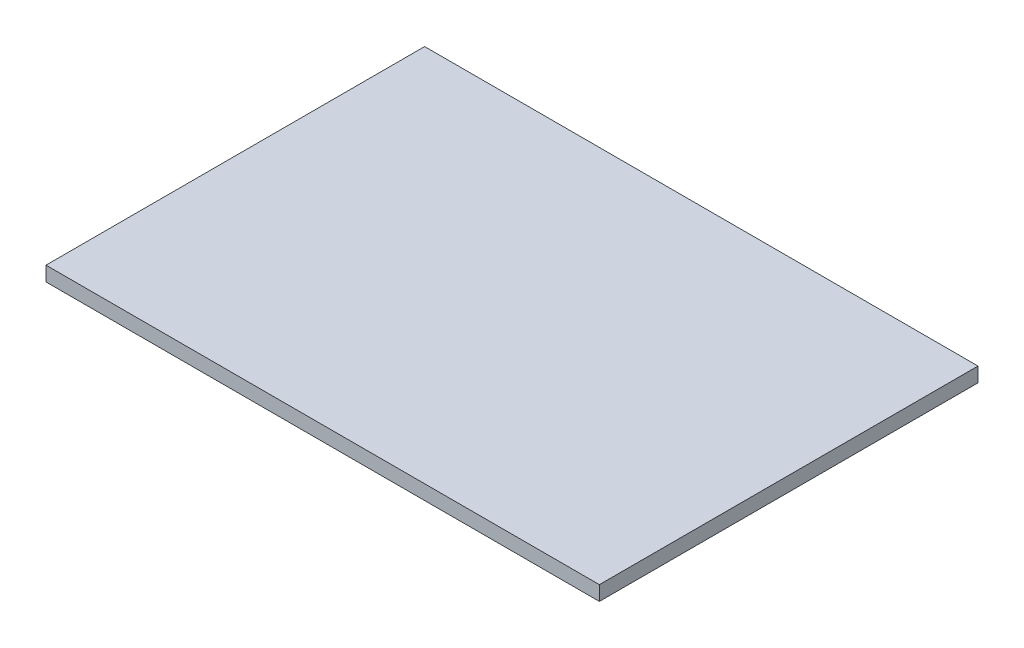
ISO-10303-21;
HEADER;
FILE_DESCRIPTION(('STEP AP214'),'2;1');
FILE_NAME('part.step','',(''),(''),'','','');
FILE_SCHEMA(('AUTOMOTIVE_DESIGN { 1 0 10303 214 1 1 1 1 }'));
ENDSEC;
DATA;
#1=APPLICATION_CONTEXT('core data for automotive mechanical design processes');
#2=APPLICATION_PROTOCOL_DEFINITION('international standard','automotive_design',2000,#1);
#3=PRODUCT_CONTEXT('',#1,'mechanical');
#4=PRODUCT('Part','Part','',(#3));
#5=PRODUCT_RELATED_PRODUCT_CATEGORY('part','',(#4));
#6=PRODUCT_DEFINITION_FORMATION('','',#4);
#7=PRODUCT_DEFINITION_CONTEXT('part definition',#1,'design');
#8=PRODUCT_DEFINITION('design','',#6,#7);
#9=PRODUCT_DEFINITION_SHAPE('','',#8);
#10=(LENGTH_UNIT() NAMED_UNIT(*) SI_UNIT(.MILLI.,.METRE.));
#11=(NAMED_UNIT(*) PLANE_ANGLE_UNIT() SI_UNIT($,.RADIAN.));
#12=(NAMED_UNIT(*) SI_UNIT($,.STERADIAN.) SOLID_ANGLE_UNIT());
#13=UNCERTAINTY_MEASURE_WITH_UNIT(LENGTH_MEASURE(1.E-05),#10,'distance_accuracy_value','');
#14=(GEOMETRIC_REPRESENTATION_CONTEXT(3) GLOBAL_UNCERTAINTY_ASSIGNED_CONTEXT((#13)) GLOBAL_UNIT_ASSIGNED_CONTEXT((#10,
#11,#12)) REPRESENTATION_CONTEXT('',''));
#15=CARTESIAN_POINT('',(0.,0.,0.));
#16=DIRECTION('',(0.,0.,1.));
#17=DIRECTION('',(1.,0.,0.));
#18=AXIS2_PLACEMENT_3D('',#15,#16,#17);
#19=CARTESIAN_POINT('',(95.,5.,-65.));
#20=DIRECTION('',(-1.,0.,0.));
#21=DIRECTION('',(0.,0.,1.));
#22=AXIS2_PLACEMENT_3D('',#19,#20,#21);
#23=PLANE('',#22);
#24=DIRECTION('',(0.,0.,-1.));
#25=VECTOR('',#24,1.);
#26=CARTESIAN_POINT('',(95.,0.,-65.));
#27=LINE('',#26,#25);
#28=CARTESIAN_POINT('',(95.,0.,65.));
#29=VERTEX_POINT('',#28);
#30=CARTESIAN_POINT('',(95.,0.,-65.));
#31=VERTEX_POINT('',#30);
#32=EDGE_CURVE('E96',#29,#31,#27,.T.);
#33=ORIENTED_EDGE('',*,*,#32,.T.);
#34=DIRECTION('',(0.,-1.,0.));
#35=VECTOR('',#34,1.);
#36=CARTESIAN_POINT('',(95.,5.,-65.));
#37=LINE('',#36,#35);
#38=CARTESIAN_POINT('',(95.,5.,-65.));
#39=VERTEX_POINT('',#38);
#40=EDGE_CURVE('E11',#39,#31,#37,.T.);
#41=ORIENTED_EDGE('',*,*,#40,.F.);
#42=DIRECTION('',(0.,0.,-1.));
#43=VECTOR('',#42,1.);
#44=CARTESIAN_POINT('',(95.,5.,-65.));
#45=LINE('',#44,#43);
#46=CARTESIAN_POINT('',(95.,5.,65.));
#47=VERTEX_POINT('',#46);
#48=EDGE_CURVE('E84',#47,#39,#45,.T.);
#49=ORIENTED_EDGE('',*,*,#48,.F.);
#50=DIRECTION('',(0.,-1.,0.));
#51=VECTOR('',#50,1.);
#52=CARTESIAN_POINT('',(95.,5.,65.));
#53=LINE('',#52,#51);
#54=EDGE_CURVE('E92',#47,#29,#53,.T.);
#55=ORIENTED_EDGE('',*,*,#54,.T.);
#56=EDGE_LOOP('',(#33,#41,#49,#55));
#57=FACE_BOUND('',#56,.T.);
#58=ADVANCED_FACE('F33',(#57),#23,.F.);
#59=CARTESIAN_POINT('',(-95.,5.,-65.));
#60=DIRECTION('',(0.,0.,1.));
#61=DIRECTION('',(1.,0.,0.));
#62=AXIS2_PLACEMENT_3D('',#59,#60,#61);
#63=PLANE('',#62);
#64=DIRECTION('',(-1.,0.,0.));
#65=VECTOR('',#64,1.);
#66=CARTESIAN_POINT('',(-95.,0.,-65.));
#67=LINE('',#66,#65);
#68=CARTESIAN_POINT('',(-95.,0.,-65.));
#69=VERTEX_POINT('',#68);
#70=EDGE_CURVE('E88',#31,#69,#67,.T.);
#71=ORIENTED_EDGE('',*,*,#70,.T.);
#72=DIRECTION('',(0.,-1.,0.));
#73=VECTOR('',#72,1.);
#74=CARTESIAN_POINT('',(-95.,5.,-65.));
#75=LINE('',#74,#73);
#76=CARTESIAN_POINT('',(-95.,5.,-65.));
#77=VERTEX_POINT('',#76);
#78=EDGE_CURVE('E41',#77,#69,#75,.T.);
#79=ORIENTED_EDGE('',*,*,#78,.F.);
#80=DIRECTION('',(-1.,0.,0.));
#81=VECTOR('',#80,1.);
#82=CARTESIAN_POINT('',(-95.,5.,-65.));
#83=LINE('',#82,#81);
#84=EDGE_CURVE('E79',#39,#77,#83,.T.);
#85=ORIENTED_EDGE('',*,*,#84,.F.);
#86=ORIENTED_EDGE('',*,*,#40,.T.);
#87=EDGE_LOOP('',(#71,#79,#85,#86));
#88=FACE_BOUND('',#87,.T.);
#89=ADVANCED_FACE('F87',(#88),#63,.F.);
#90=CARTESIAN_POINT('',(-95.,5.,-65.));
#91=DIRECTION('',(1.,0.,0.));
#92=DIRECTION('',(0.,0.,-1.));
#93=AXIS2_PLACEMENT_3D('',#90,#91,#92);
#94=PLANE('',#93);
#95=DIRECTION('',(0.,0.,1.));
#96=VECTOR('',#95,1.);
#97=CARTESIAN_POINT('',(-95.,0.,-65.));
#98=LINE('',#97,#96);
#99=CARTESIAN_POINT('',(-95.,0.,65.));
#100=VERTEX_POINT('',#99);
#101=EDGE_CURVE('E66',#69,#100,#98,.T.);
#102=ORIENTED_EDGE('',*,*,#101,.T.);
#103=DIRECTION('',(0.,-1.,0.));
#104=VECTOR('',#103,1.);
#105=CARTESIAN_POINT('',(-95.,5.,65.));
#106=LINE('',#105,#104);
#107=CARTESIAN_POINT('',(-95.,5.,65.));
#108=VERTEX_POINT('',#107);
#109=EDGE_CURVE('E89',#108,#100,#106,.T.);
#110=ORIENTED_EDGE('',*,*,#109,.F.);
#111=DIRECTION('',(0.,0.,1.));
#112=VECTOR('',#111,1.);
#113=CARTESIAN_POINT('',(-95.,5.,-65.));
#114=LINE('',#113,#112);
#115=EDGE_CURVE('E82',#77,#108,#114,.T.);
#116=ORIENTED_EDGE('',*,*,#115,.F.);
#117=ORIENTED_EDGE('',*,*,#78,.T.);
#118=EDGE_LOOP('',(#102,#110,#116,#117));
#119=FACE_BOUND('',#118,.T.);
#120=ADVANCED_FACE('F90',(#119),#94,.F.);
#121=CARTESIAN_POINT('',(-95.,5.,65.));
#122=DIRECTION('',(0.,0.,-1.));
#123=DIRECTION('',(-1.,0.,0.));
#124=AXIS2_PLACEMENT_3D('',#121,#122,#123);
#125=PLANE('',#124);
#126=DIRECTION('',(1.,0.,0.));
#127=VECTOR('',#126,1.);
#128=CARTESIAN_POINT('',(-95.,0.,65.));
#129=LINE('',#128,#127);
#130=EDGE_CURVE('E72',#100,#29,#129,.T.);
#131=ORIENTED_EDGE('',*,*,#130,.T.);
#132=ORIENTED_EDGE('',*,*,#54,.F.);
#133=DIRECTION('',(1.,0.,0.));
#134=VECTOR('',#133,1.);
#135=CARTESIAN_POINT('',(-95.,5.,65.));
#136=LINE('',#135,#134);
#137=EDGE_CURVE('E49',#108,#47,#136,.T.);
#138=ORIENTED_EDGE('',*,*,#137,.F.);
#139=ORIENTED_EDGE('',*,*,#109,.T.);
#140=EDGE_LOOP('',(#131,#132,#138,#139));
#141=FACE_BOUND('',#140,.T.);
#142=ADVANCED_FACE('F103',(#141),#125,.F.);
#143=CARTESIAN_POINT('',(0.,5.,0.));
#144=DIRECTION('',(0.,1.,0.));
#145=DIRECTION('',(0.,0.,1.));
#146=AXIS2_PLACEMENT_3D('',#143,#144,#145);
#147=PLANE('',#146);
#148=ORIENTED_EDGE('',*,*,#48,.T.);
#149=ORIENTED_EDGE('',*,*,#84,.T.);
#150=ORIENTED_EDGE('',*,*,#115,.T.);
#151=ORIENTED_EDGE('',*,*,#137,.T.);
#152=EDGE_LOOP('',(#148,#149,#150,#151));
#153=FACE_BOUND('',#152,.T.);
#154=ADVANCED_FACE('F80',(#153),#147,.T.);
#155=CARTESIAN_POINT('',(0.,0.,0.));
#156=DIRECTION('',(0.,1.,0.));
#157=DIRECTION('',(0.,0.,1.));
#158=AXIS2_PLACEMENT_3D('',#155,#156,#157);
#159=PLANE('',#158);
#160=ORIENTED_EDGE('',*,*,#32,.F.);
#161=ORIENTED_EDGE('',*,*,#130,.F.);
#162=ORIENTED_EDGE('',*,*,#101,.F.);
#163=ORIENTED_EDGE('',*,*,#70,.F.);
#164=EDGE_LOOP('',(#160,#161,#162,#163));
#165=FACE_BOUND('',#164,.T.);
#166=ADVANCED_FACE('F106',(#165),#159,.F.);
#167=CLOSED_SHELL('',(#58,#89,#120,#142,#154,#166));
#168=MANIFOLD_SOLID_BREP('B2',#167);
#169=ADVANCED_BREP_SHAPE_REPRESENTATION('',(#18,#168),#14);
#170=SHAPE_DEFINITION_REPRESENTATION(#9,#169);
ENDSEC;
END-ISO-10303-21;
